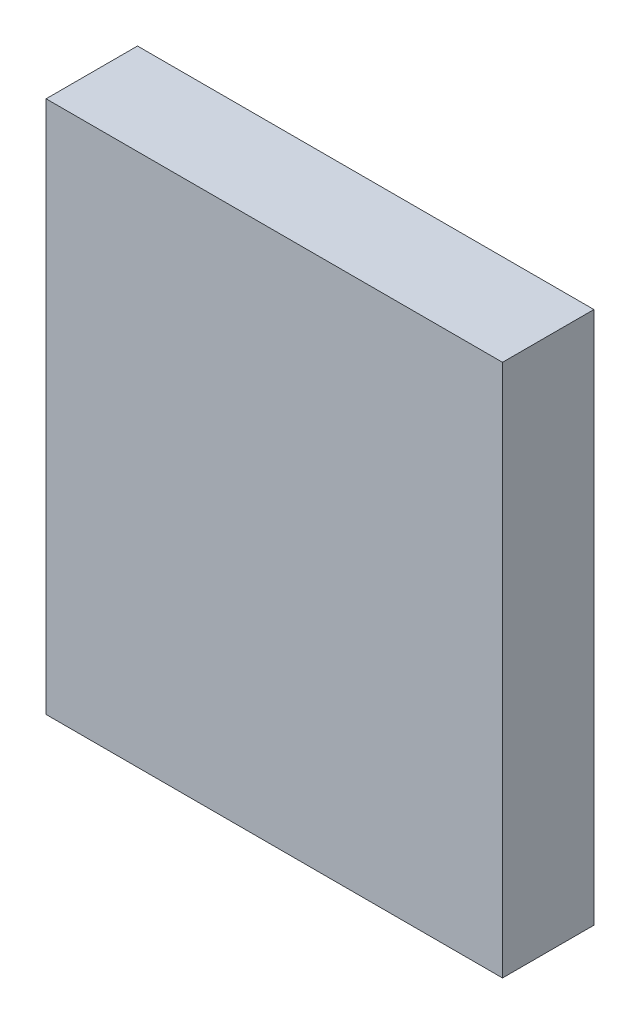
ISO-10303-21;
HEADER;
FILE_DESCRIPTION(('STEP AP214'),'2;1');
FILE_NAME('part.step','',(''),(''),'','','');
FILE_SCHEMA(('AUTOMOTIVE_DESIGN { 1 0 10303 214 1 1 1 1 }'));
ENDSEC;
DATA;
#1=APPLICATION_CONTEXT('core data for automotive mechanical design processes');
#2=APPLICATION_PROTOCOL_DEFINITION('international standard','automotive_design',2000,#1);
#3=PRODUCT_CONTEXT('',#1,'mechanical');
#4=PRODUCT('Part','Part','',(#3));
#5=PRODUCT_RELATED_PRODUCT_CATEGORY('part','',(#4));
#6=PRODUCT_DEFINITION_FORMATION('','',#4);
#7=PRODUCT_DEFINITION_CONTEXT('part definition',#1,'design');
#8=PRODUCT_DEFINITION('design','',#6,#7);
#9=PRODUCT_DEFINITION_SHAPE('','',#8);
#10=(LENGTH_UNIT() NAMED_UNIT(*) SI_UNIT(.MILLI.,.METRE.));
#11=(NAMED_UNIT(*) PLANE_ANGLE_UNIT() SI_UNIT($,.RADIAN.));
#12=(NAMED_UNIT(*) SI_UNIT($,.STERADIAN.) SOLID_ANGLE_UNIT());
#13=UNCERTAINTY_MEASURE_WITH_UNIT(LENGTH_MEASURE(1.E-05),#10,'distance_accuracy_value','');
#14=(GEOMETRIC_REPRESENTATION_CONTEXT(3) GLOBAL_UNCERTAINTY_ASSIGNED_CONTEXT((#13)) GLOBAL_UNIT_ASSIGNED_CONTEXT((#10,
#11,#12)) REPRESENTATION_CONTEXT('',''));
#15=CARTESIAN_POINT('',(0.,0.,0.));
#16=DIRECTION('',(0.,0.,1.));
#17=DIRECTION('',(1.,0.,0.));
#18=AXIS2_PLACEMENT_3D('',#15,#16,#17);
#19=CARTESIAN_POINT('',(-0.445925,0.04,1.2));
#20=DIRECTION('',(0.,0.,1.));
#21=DIRECTION('',(1.,0.,0.));
#22=AXIS2_PLACEMENT_3D('',#19,#20,#21);
#23=PLANE('',#22);
#24=DIRECTION('',(1.,0.,0.));
#25=VECTOR('',#24,1.);
#26=CARTESIAN_POINT('',(-3.44185,-3.46,1.2));
#27=LINE('',#26,#25);
#28=CARTESIAN_POINT('',(-3.44185,-3.46,1.2));
#29=VERTEX_POINT('',#28);
#30=CARTESIAN_POINT('',(2.55,-3.46,1.2));
#31=VERTEX_POINT('',#30);
#32=EDGE_CURVE('E85',#29,#31,#27,.T.);
#33=ORIENTED_EDGE('',*,*,#32,.T.);
#34=DIRECTION('',(0.,1.,0.));
#35=VECTOR('',#34,1.);
#36=CARTESIAN_POINT('',(2.55,-3.46,1.2));
#37=LINE('',#36,#35);
#38=CARTESIAN_POINT('',(2.55,3.54,1.2));
#39=VERTEX_POINT('',#38);
#40=EDGE_CURVE('E95',#31,#39,#37,.T.);
#41=ORIENTED_EDGE('',*,*,#40,.T.);
#42=DIRECTION('',(-1.,0.,0.));
#43=VECTOR('',#42,1.);
#44=CARTESIAN_POINT('',(2.55,3.54,1.2));
#45=LINE('',#44,#43);
#46=CARTESIAN_POINT('',(-3.44185,3.54,1.2));
#47=VERTEX_POINT('',#46);
#48=EDGE_CURVE('E20',#39,#47,#45,.T.);
#49=ORIENTED_EDGE('',*,*,#48,.T.);
#50=DIRECTION('',(0.,-1.,0.));
#51=VECTOR('',#50,1.);
#52=CARTESIAN_POINT('',(-3.44185,3.54,1.2));
#53=LINE('',#52,#51);
#54=EDGE_CURVE('E11',#47,#29,#53,.T.);
#55=ORIENTED_EDGE('',*,*,#54,.T.);
#56=EDGE_LOOP('',(#33,#41,#49,#55));
#57=FACE_BOUND('',#56,.T.);
#58=ADVANCED_FACE('F16',(#57),#23,.T.);
#59=CARTESIAN_POINT('',(-0.445925,0.04,0.));
#60=DIRECTION('',(0.,0.,1.));
#61=DIRECTION('',(1.,0.,0.));
#62=AXIS2_PLACEMENT_3D('',#59,#60,#61);
#63=PLANE('',#62);
#64=DIRECTION('',(1.,0.,0.));
#65=VECTOR('',#64,1.);
#66=CARTESIAN_POINT('',(-3.44185,-3.46,0.));
#67=LINE('',#66,#65);
#68=CARTESIAN_POINT('',(-3.44185,-3.46,0.));
#69=VERTEX_POINT('',#68);
#70=CARTESIAN_POINT('',(2.55,-3.46,0.));
#71=VERTEX_POINT('',#70);
#72=EDGE_CURVE('E78',#69,#71,#67,.T.);
#73=ORIENTED_EDGE('',*,*,#72,.F.);
#74=DIRECTION('',(0.,-1.,0.));
#75=VECTOR('',#74,1.);
#76=CARTESIAN_POINT('',(-3.44185,3.54,0.));
#77=LINE('',#76,#75);
#78=CARTESIAN_POINT('',(-3.44185,3.54,0.));
#79=VERTEX_POINT('',#78);
#80=EDGE_CURVE('E27',#79,#69,#77,.T.);
#81=ORIENTED_EDGE('',*,*,#80,.F.);
#82=DIRECTION('',(-1.,0.,0.));
#83=VECTOR('',#82,1.);
#84=CARTESIAN_POINT('',(2.55,3.54,0.));
#85=LINE('',#84,#83);
#86=CARTESIAN_POINT('',(2.55,3.54,0.));
#87=VERTEX_POINT('',#86);
#88=EDGE_CURVE('E93',#87,#79,#85,.T.);
#89=ORIENTED_EDGE('',*,*,#88,.F.);
#90=DIRECTION('',(0.,1.,0.));
#91=VECTOR('',#90,1.);
#92=CARTESIAN_POINT('',(2.55,-3.46,0.));
#93=LINE('',#92,#91);
#94=EDGE_CURVE('E56',#71,#87,#93,.T.);
#95=ORIENTED_EDGE('',*,*,#94,.F.);
#96=EDGE_LOOP('',(#73,#81,#89,#95));
#97=FACE_BOUND('',#96,.T.);
#98=ADVANCED_FACE('F18',(#97),#63,.F.);
#99=CARTESIAN_POINT('',(-3.44185,3.54,0.));
#100=DIRECTION('',(1.,0.,0.));
#101=DIRECTION('',(0.,1.,0.));
#102=AXIS2_PLACEMENT_3D('',#99,#100,#101);
#103=PLANE('',#102);
#104=DIRECTION('',(0.,0.,1.));
#105=VECTOR('',#104,1.);
#106=CARTESIAN_POINT('',(-3.44185,3.54,0.));
#107=LINE('',#106,#105);
#108=EDGE_CURVE('E73',#79,#47,#107,.T.);
#109=ORIENTED_EDGE('',*,*,#108,.F.);
#110=ORIENTED_EDGE('',*,*,#80,.T.);
#111=DIRECTION('',(0.,0.,1.));
#112=VECTOR('',#111,1.);
#113=CARTESIAN_POINT('',(-3.44185,-3.46,0.));
#114=LINE('',#113,#112);
#115=EDGE_CURVE('E71',#69,#29,#114,.T.);
#116=ORIENTED_EDGE('',*,*,#115,.T.);
#117=ORIENTED_EDGE('',*,*,#54,.F.);
#118=EDGE_LOOP('',(#109,#110,#116,#117));
#119=FACE_BOUND('',#118,.T.);
#120=ADVANCED_FACE('F69',(#119),#103,.F.);
#121=CARTESIAN_POINT('',(2.55,3.54,0.));
#122=DIRECTION('',(0.,-1.,0.));
#123=DIRECTION('',(0.,0.,-1.));
#124=AXIS2_PLACEMENT_3D('',#121,#122,#123);
#125=PLANE('',#124);
#126=DIRECTION('',(0.,0.,1.));
#127=VECTOR('',#126,1.);
#128=CARTESIAN_POINT('',(2.55,3.54,0.));
#129=LINE('',#128,#127);
#130=EDGE_CURVE('E92',#87,#39,#129,.T.);
#131=ORIENTED_EDGE('',*,*,#130,.F.);
#132=ORIENTED_EDGE('',*,*,#88,.T.);
#133=ORIENTED_EDGE('',*,*,#108,.T.);
#134=ORIENTED_EDGE('',*,*,#48,.F.);
#135=EDGE_LOOP('',(#131,#132,#133,#134));
#136=FACE_BOUND('',#135,.T.);
#137=ADVANCED_FACE('F127',(#136),#125,.F.);
#138=CARTESIAN_POINT('',(2.55,-3.46,0.));
#139=DIRECTION('',(-1.,0.,0.));
#140=DIRECTION('',(0.,0.,1.));
#141=AXIS2_PLACEMENT_3D('',#138,#139,#140);
#142=PLANE('',#141);
#143=DIRECTION('',(0.,0.,1.));
#144=VECTOR('',#143,1.);
#145=CARTESIAN_POINT('',(2.55,-3.46,0.));
#146=LINE('',#145,#144);
#147=EDGE_CURVE('E82',#71,#31,#146,.T.);
#148=ORIENTED_EDGE('',*,*,#147,.F.);
#149=ORIENTED_EDGE('',*,*,#94,.T.);
#150=ORIENTED_EDGE('',*,*,#130,.T.);
#151=ORIENTED_EDGE('',*,*,#40,.F.);
#152=EDGE_LOOP('',(#148,#149,#150,#151));
#153=FACE_BOUND('',#152,.T.);
#154=ADVANCED_FACE('F114',(#153),#142,.F.);
#155=CARTESIAN_POINT('',(-3.44185,-3.46,0.));
#156=DIRECTION('',(0.,1.,0.));
#157=DIRECTION('',(1.,0.,0.));
#158=AXIS2_PLACEMENT_3D('',#155,#156,#157);
#159=PLANE('',#158);
#160=ORIENTED_EDGE('',*,*,#115,.F.);
#161=ORIENTED_EDGE('',*,*,#72,.T.);
#162=ORIENTED_EDGE('',*,*,#147,.T.);
#163=ORIENTED_EDGE('',*,*,#32,.F.);
#164=EDGE_LOOP('',(#160,#161,#162,#163));
#165=FACE_BOUND('',#164,.T.);
#166=ADVANCED_FACE('F84',(#165),#159,.F.);
#167=CLOSED_SHELL('',(#58,#98,#120,#137,#154,#166));
#168=MANIFOLD_SOLID_BREP('B1',#167);
#169=ADVANCED_BREP_SHAPE_REPRESENTATION('',(#18,#168),#14);
#170=SHAPE_DEFINITION_REPRESENTATION(#9,#169);
ENDSEC;
END-ISO-10303-21;
